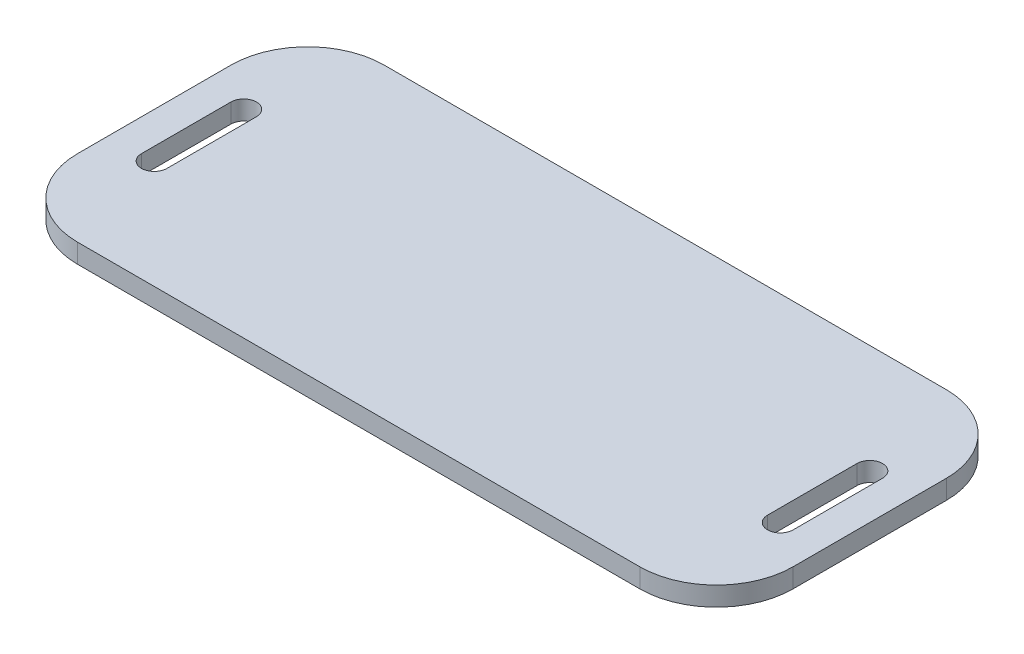
ISO-10303-21;
HEADER;
FILE_DESCRIPTION(('STEP AP214'),'2;1');
FILE_NAME('part.step','',(''),(''),'','','');
FILE_SCHEMA(('AUTOMOTIVE_DESIGN { 1 0 10303 214 1 1 1 1 }'));
ENDSEC;
DATA;
#1=APPLICATION_CONTEXT('core data for automotive mechanical design processes');
#2=APPLICATION_PROTOCOL_DEFINITION('international standard','automotive_design',2000,#1);
#3=PRODUCT_CONTEXT('',#1,'mechanical');
#4=PRODUCT('Part','Part','',(#3));
#5=PRODUCT_RELATED_PRODUCT_CATEGORY('part','',(#4));
#6=PRODUCT_DEFINITION_FORMATION('','',#4);
#7=PRODUCT_DEFINITION_CONTEXT('part definition',#1,'design');
#8=PRODUCT_DEFINITION('design','',#6,#7);
#9=PRODUCT_DEFINITION_SHAPE('','',#8);
#10=(LENGTH_UNIT() NAMED_UNIT(*) SI_UNIT(.MILLI.,.METRE.));
#11=(NAMED_UNIT(*) PLANE_ANGLE_UNIT() SI_UNIT($,.RADIAN.));
#12=(NAMED_UNIT(*) SI_UNIT($,.STERADIAN.) SOLID_ANGLE_UNIT());
#13=UNCERTAINTY_MEASURE_WITH_UNIT(LENGTH_MEASURE(1.E-05),#10,'distance_accuracy_value','');
#14=(GEOMETRIC_REPRESENTATION_CONTEXT(3) GLOBAL_UNCERTAINTY_ASSIGNED_CONTEXT((#13)) GLOBAL_UNIT_ASSIGNED_CONTEXT((#10,
#11,#12)) REPRESENTATION_CONTEXT('',''));
#15=CARTESIAN_POINT('',(0.,0.,0.));
#16=DIRECTION('',(0.,0.,1.));
#17=DIRECTION('',(1.,0.,0.));
#18=AXIS2_PLACEMENT_3D('',#15,#16,#17);
#19=CARTESIAN_POINT('',(-279.4,19.05,76.2));
#20=DIRECTION('',(0.,1.,0.));
#21=DIRECTION('',(0.,0.,1.));
#22=AXIS2_PLACEMENT_3D('',#19,#20,#21);
#23=PLANE('',#22);
#24=CARTESIAN_POINT('',(-279.4,19.05,76.2));
#25=DIRECTION('',(0.,1.,0.));
#26=DIRECTION('',(0.,0.,1.));
#27=AXIS2_PLACEMENT_3D('',#24,#25,#26);
#28=CIRCLE('',#27,76.2);
#29=CARTESIAN_POINT('',(-355.6,19.05,76.2));
#30=VERTEX_POINT('',#29);
#31=CARTESIAN_POINT('',(-279.4,19.05,152.4));
#32=VERTEX_POINT('',#31);
#33=EDGE_CURVE('E213',#30,#32,#28,.T.);
#34=ORIENTED_EDGE('',*,*,#33,.T.);
#35=DIRECTION('',(1.,0.,0.));
#36=VECTOR('',#35,1.);
#37=CARTESIAN_POINT('',(-279.4,19.05,152.4));
#38=LINE('',#37,#36);
#39=CARTESIAN_POINT('',(279.4,19.05,152.4));
#40=VERTEX_POINT('',#39);
#41=EDGE_CURVE('E216',#32,#40,#38,.T.);
#42=ORIENTED_EDGE('',*,*,#41,.T.);
#43=CARTESIAN_POINT('',(279.4,19.05,76.2));
#44=DIRECTION('',(0.,1.,0.));
#45=DIRECTION('',(0.,0.,1.));
#46=AXIS2_PLACEMENT_3D('',#43,#44,#45);
#47=CIRCLE('',#46,76.2);
#48=CARTESIAN_POINT('',(355.6,19.05,76.2));
#49=VERTEX_POINT('',#48);
#50=EDGE_CURVE('E219',#40,#49,#47,.T.);
#51=ORIENTED_EDGE('',*,*,#50,.T.);
#52=DIRECTION('',(0.,0.,-1.));
#53=VECTOR('',#52,1.);
#54=CARTESIAN_POINT('',(355.6,19.05,-76.2));
#55=LINE('',#54,#53);
#56=CARTESIAN_POINT('',(355.6,19.05,-76.2));
#57=VERTEX_POINT('',#56);
#58=EDGE_CURVE('E221',#49,#57,#55,.T.);
#59=ORIENTED_EDGE('',*,*,#58,.T.);
#60=CARTESIAN_POINT('',(279.4,19.05,-76.2));
#61=DIRECTION('',(0.,1.,0.));
#62=DIRECTION('',(0.,0.,-1.));
#63=AXIS2_PLACEMENT_3D('',#60,#61,#62);
#64=CIRCLE('',#63,76.2);
#65=CARTESIAN_POINT('',(279.4,19.05,-152.4));
#66=VERTEX_POINT('',#65);
#67=EDGE_CURVE('E223',#57,#66,#64,.T.);
#68=ORIENTED_EDGE('',*,*,#67,.T.);
#69=DIRECTION('',(-1.,0.,0.));
#70=VECTOR('',#69,1.);
#71=CARTESIAN_POINT('',(-279.4,19.05,-152.4));
#72=LINE('',#71,#70);
#73=CARTESIAN_POINT('',(-279.4,19.05,-152.4));
#74=VERTEX_POINT('',#73);
#75=EDGE_CURVE('E225',#66,#74,#72,.T.);
#76=ORIENTED_EDGE('',*,*,#75,.T.);
#77=CARTESIAN_POINT('',(-279.4,19.05,-76.2));
#78=DIRECTION('',(0.,1.,0.));
#79=DIRECTION('',(0.,0.,1.));
#80=AXIS2_PLACEMENT_3D('',#77,#78,#79);
#81=CIRCLE('',#80,76.2);
#82=CARTESIAN_POINT('',(-355.6,19.05,-76.2));
#83=VERTEX_POINT('',#82);
#84=EDGE_CURVE('E227',#74,#83,#81,.T.);
#85=ORIENTED_EDGE('',*,*,#84,.T.);
#86=DIRECTION('',(0.,0.,1.));
#87=VECTOR('',#86,1.);
#88=CARTESIAN_POINT('',(-355.6,19.05,-76.2));
#89=LINE('',#88,#87);
#90=EDGE_CURVE('E229',#83,#30,#89,.T.);
#91=ORIENTED_EDGE('',*,*,#90,.T.);
#92=EDGE_LOOP('',(#34,#42,#51,#59,#68,#76,#85,#91));
#93=FACE_BOUND('',#92,.T.);
#94=CARTESIAN_POINT('',(311.15,19.05,-44.45));
#95=DIRECTION('',(0.,1.,0.));
#96=DIRECTION('',(0.,0.,1.));
#97=AXIS2_PLACEMENT_3D('',#94,#95,#96);
#98=CIRCLE('',#97,12.7);
#99=CARTESIAN_POINT('',(323.85,19.05,-44.45));
#100=VERTEX_POINT('',#99);
#101=CARTESIAN_POINT('',(298.45,19.05,-44.45));
#102=VERTEX_POINT('',#101);
#103=EDGE_CURVE('E177',#100,#102,#98,.T.);
#104=ORIENTED_EDGE('',*,*,#103,.F.);
#105=DIRECTION('',(0.,0.,-1.));
#106=VECTOR('',#105,1.);
#107=CARTESIAN_POINT('',(323.85,19.05,-44.45));
#108=LINE('',#107,#106);
#109=CARTESIAN_POINT('',(323.85,19.05,44.45));
#110=VERTEX_POINT('',#109);
#111=EDGE_CURVE('E185',#110,#100,#108,.T.);
#112=ORIENTED_EDGE('',*,*,#111,.F.);
#113=CARTESIAN_POINT('',(311.15,19.05,44.45));
#114=DIRECTION('',(0.,1.,0.));
#115=DIRECTION('',(0.,0.,1.));
#116=AXIS2_PLACEMENT_3D('',#113,#114,#115);
#117=CIRCLE('',#116,12.7);
#118=CARTESIAN_POINT('',(298.45,19.05,44.45));
#119=VERTEX_POINT('',#118);
#120=EDGE_CURVE('E199',#119,#110,#117,.T.);
#121=ORIENTED_EDGE('',*,*,#120,.F.);
#122=DIRECTION('',(0.,0.,1.));
#123=VECTOR('',#122,1.);
#124=CARTESIAN_POINT('',(298.45,19.05,-44.45));
#125=LINE('',#124,#123);
#126=EDGE_CURVE('E196',#102,#119,#125,.T.);
#127=ORIENTED_EDGE('',*,*,#126,.F.);
#128=EDGE_LOOP('',(#104,#112,#121,#127));
#129=FACE_BOUND('',#128,.T.);
#130=DIRECTION('',(0.,0.,-1.));
#131=VECTOR('',#130,1.);
#132=CARTESIAN_POINT('',(-323.85,19.05,-44.45));
#133=LINE('',#132,#131);
#134=CARTESIAN_POINT('',(-323.85,19.05,44.45));
#135=VERTEX_POINT('',#134);
#136=CARTESIAN_POINT('',(-323.85,19.05,-44.45));
#137=VERTEX_POINT('',#136);
#138=EDGE_CURVE('E171',#135,#137,#133,.T.);
#139=ORIENTED_EDGE('',*,*,#138,.T.);
#140=CARTESIAN_POINT('',(-311.15,19.05,-44.45));
#141=DIRECTION('',(0.,-1.,0.));
#142=DIRECTION('',(0.,0.,1.));
#143=AXIS2_PLACEMENT_3D('',#140,#141,#142);
#144=CIRCLE('',#143,12.7);
#145=CARTESIAN_POINT('',(-298.45,19.05,-44.45));
#146=VERTEX_POINT('',#145);
#147=EDGE_CURVE('E48',#137,#146,#144,.T.);
#148=ORIENTED_EDGE('',*,*,#147,.T.);
#149=DIRECTION('',(0.,0.,1.));
#150=VECTOR('',#149,1.);
#151=CARTESIAN_POINT('',(-298.45,19.05,-44.45));
#152=LINE('',#151,#150);
#153=CARTESIAN_POINT('',(-298.45,19.05,44.45));
#154=VERTEX_POINT('',#153);
#155=EDGE_CURVE('E162',#146,#154,#152,.T.);
#156=ORIENTED_EDGE('',*,*,#155,.T.);
#157=CARTESIAN_POINT('',(-311.15,19.05,44.45));
#158=DIRECTION('',(0.,-1.,0.));
#159=DIRECTION('',(0.,0.,1.));
#160=AXIS2_PLACEMENT_3D('',#157,#158,#159);
#161=CIRCLE('',#160,12.7);
#162=EDGE_CURVE('E165',#154,#135,#161,.T.);
#163=ORIENTED_EDGE('',*,*,#162,.T.);
#164=EDGE_LOOP('',(#139,#148,#156,#163));
#165=FACE_BOUND('',#164,.T.);
#166=ADVANCED_FACE('F33',(#93,#129,#165),#23,.T.);
#167=CARTESIAN_POINT('',(-279.4,0.,76.2));
#168=DIRECTION('',(0.,1.,0.));
#169=DIRECTION('',(0.,0.,1.));
#170=AXIS2_PLACEMENT_3D('',#167,#168,#169);
#171=PLANE('',#170);
#172=CARTESIAN_POINT('',(-279.4,0.,76.2));
#173=DIRECTION('',(0.,1.,0.));
#174=DIRECTION('',(0.,0.,1.));
#175=AXIS2_PLACEMENT_3D('',#172,#173,#174);
#176=CIRCLE('',#175,76.2);
#177=CARTESIAN_POINT('',(-355.6,0.,76.2));
#178=VERTEX_POINT('',#177);
#179=CARTESIAN_POINT('',(-279.4,0.,152.4));
#180=VERTEX_POINT('',#179);
#181=EDGE_CURVE('E206',#178,#180,#176,.T.);
#182=ORIENTED_EDGE('',*,*,#181,.F.);
#183=DIRECTION('',(0.,0.,1.));
#184=VECTOR('',#183,1.);
#185=CARTESIAN_POINT('',(-355.6,0.,-76.2));
#186=LINE('',#185,#184);
#187=CARTESIAN_POINT('',(-355.6,0.,-76.2));
#188=VERTEX_POINT('',#187);
#189=EDGE_CURVE('E217',#188,#178,#186,.T.);
#190=ORIENTED_EDGE('',*,*,#189,.F.);
#191=CARTESIAN_POINT('',(-279.4,0.,-76.2));
#192=DIRECTION('',(0.,1.,0.));
#193=DIRECTION('',(0.,0.,1.));
#194=AXIS2_PLACEMENT_3D('',#191,#192,#193);
#195=CIRCLE('',#194,76.2);
#196=CARTESIAN_POINT('',(-279.4,0.,-152.4));
#197=VERTEX_POINT('',#196);
#198=EDGE_CURVE('E244',#197,#188,#195,.T.);
#199=ORIENTED_EDGE('',*,*,#198,.F.);
#200=DIRECTION('',(-1.,0.,0.));
#201=VECTOR('',#200,1.);
#202=CARTESIAN_POINT('',(-279.4,0.,-152.4));
#203=LINE('',#202,#201);
#204=CARTESIAN_POINT('',(279.4,0.,-152.4));
#205=VERTEX_POINT('',#204);
#206=EDGE_CURVE('E242',#205,#197,#203,.T.);
#207=ORIENTED_EDGE('',*,*,#206,.F.);
#208=CARTESIAN_POINT('',(279.4,0.,-76.2));
#209=DIRECTION('',(0.,1.,0.));
#210=DIRECTION('',(0.,0.,-1.));
#211=AXIS2_PLACEMENT_3D('',#208,#209,#210);
#212=CIRCLE('',#211,76.2);
#213=CARTESIAN_POINT('',(355.6,0.,-76.2));
#214=VERTEX_POINT('',#213);
#215=EDGE_CURVE('E240',#214,#205,#212,.T.);
#216=ORIENTED_EDGE('',*,*,#215,.F.);
#217=DIRECTION('',(0.,0.,-1.));
#218=VECTOR('',#217,1.);
#219=CARTESIAN_POINT('',(355.6,0.,-76.2));
#220=LINE('',#219,#218);
#221=CARTESIAN_POINT('',(355.6,0.,76.2));
#222=VERTEX_POINT('',#221);
#223=EDGE_CURVE('E238',#222,#214,#220,.T.);
#224=ORIENTED_EDGE('',*,*,#223,.F.);
#225=CARTESIAN_POINT('',(279.4,0.,76.2));
#226=DIRECTION('',(0.,1.,0.));
#227=DIRECTION('',(0.,0.,1.));
#228=AXIS2_PLACEMENT_3D('',#225,#226,#227);
#229=CIRCLE('',#228,76.2);
#230=CARTESIAN_POINT('',(279.4,0.,152.4));
#231=VERTEX_POINT('',#230);
#232=EDGE_CURVE('E236',#231,#222,#229,.T.);
#233=ORIENTED_EDGE('',*,*,#232,.F.);
#234=DIRECTION('',(1.,0.,0.));
#235=VECTOR('',#234,1.);
#236=CARTESIAN_POINT('',(-279.4,0.,152.4));
#237=LINE('',#236,#235);
#238=EDGE_CURVE('E234',#180,#231,#237,.T.);
#239=ORIENTED_EDGE('',*,*,#238,.F.);
#240=EDGE_LOOP('',(#182,#190,#199,#207,#216,#224,#233,#239));
#241=FACE_BOUND('',#240,.T.);
#242=DIRECTION('',(0.,0.,-1.));
#243=VECTOR('',#242,1.);
#244=CARTESIAN_POINT('',(323.85,0.,-44.45));
#245=LINE('',#244,#243);
#246=CARTESIAN_POINT('',(323.85,0.,44.45));
#247=VERTEX_POINT('',#246);
#248=CARTESIAN_POINT('',(323.85,0.,-44.45));
#249=VERTEX_POINT('',#248);
#250=EDGE_CURVE('E191',#247,#249,#245,.T.);
#251=ORIENTED_EDGE('',*,*,#250,.T.);
#252=CARTESIAN_POINT('',(311.15,0.,-44.45));
#253=DIRECTION('',(0.,1.,0.));
#254=DIRECTION('',(0.,0.,1.));
#255=AXIS2_PLACEMENT_3D('',#252,#253,#254);
#256=CIRCLE('',#255,12.7);
#257=CARTESIAN_POINT('',(298.45,0.,-44.45));
#258=VERTEX_POINT('',#257);
#259=EDGE_CURVE('E181',#249,#258,#256,.T.);
#260=ORIENTED_EDGE('',*,*,#259,.T.);
#261=DIRECTION('',(0.,0.,1.));
#262=VECTOR('',#261,1.);
#263=CARTESIAN_POINT('',(298.45,0.,-44.45));
#264=LINE('',#263,#262);
#265=CARTESIAN_POINT('',(298.45,0.,44.45));
#266=VERTEX_POINT('',#265);
#267=EDGE_CURVE('E184',#258,#266,#264,.T.);
#268=ORIENTED_EDGE('',*,*,#267,.T.);
#269=CARTESIAN_POINT('',(311.15,0.,44.45));
#270=DIRECTION('',(0.,1.,0.));
#271=DIRECTION('',(0.,0.,1.));
#272=AXIS2_PLACEMENT_3D('',#269,#270,#271);
#273=CIRCLE('',#272,12.7);
#274=EDGE_CURVE('E188',#266,#247,#273,.T.);
#275=ORIENTED_EDGE('',*,*,#274,.T.);
#276=EDGE_LOOP('',(#251,#260,#268,#275));
#277=FACE_BOUND('',#276,.T.);
#278=CARTESIAN_POINT('',(-311.15,0.,-44.45));
#279=DIRECTION('',(0.,-1.,0.));
#280=DIRECTION('',(0.,0.,1.));
#281=AXIS2_PLACEMENT_3D('',#278,#279,#280);
#282=CIRCLE('',#281,12.7);
#283=CARTESIAN_POINT('',(-323.85,0.,-44.45));
#284=VERTEX_POINT('',#283);
#285=CARTESIAN_POINT('',(-298.45,0.,-44.45));
#286=VERTEX_POINT('',#285);
#287=EDGE_CURVE('E154',#284,#286,#282,.T.);
#288=ORIENTED_EDGE('',*,*,#287,.F.);
#289=DIRECTION('',(0.,0.,-1.));
#290=VECTOR('',#289,1.);
#291=CARTESIAN_POINT('',(-323.85,0.,-44.45));
#292=LINE('',#291,#290);
#293=CARTESIAN_POINT('',(-323.85,0.,44.45));
#294=VERTEX_POINT('',#293);
#295=EDGE_CURVE('E146',#294,#284,#292,.T.);
#296=ORIENTED_EDGE('',*,*,#295,.F.);
#297=CARTESIAN_POINT('',(-311.15,0.,44.45));
#298=DIRECTION('',(0.,-1.,0.));
#299=DIRECTION('',(0.,0.,1.));
#300=AXIS2_PLACEMENT_3D('',#297,#298,#299);
#301=CIRCLE('',#300,12.7);
#302=CARTESIAN_POINT('',(-298.45,0.,44.45));
#303=VERTEX_POINT('',#302);
#304=EDGE_CURVE('E153',#303,#294,#301,.T.);
#305=ORIENTED_EDGE('',*,*,#304,.F.);
#306=DIRECTION('',(0.,0.,1.));
#307=VECTOR('',#306,1.);
#308=CARTESIAN_POINT('',(-298.45,0.,-44.45));
#309=LINE('',#308,#307);
#310=EDGE_CURVE('E158',#286,#303,#309,.T.);
#311=ORIENTED_EDGE('',*,*,#310,.F.);
#312=EDGE_LOOP('',(#288,#296,#305,#311));
#313=FACE_BOUND('',#312,.T.);
#314=ADVANCED_FACE('F161',(#241,#277,#313),#171,.F.);
#315=CARTESIAN_POINT('',(-279.4,19.05,76.2));
#316=DIRECTION('',(0.,-1.,0.));
#317=DIRECTION('',(0.,0.,-1.));
#318=AXIS2_PLACEMENT_3D('',#315,#316,#317);
#319=CYLINDRICAL_SURFACE('',#318,76.2);
#320=ORIENTED_EDGE('',*,*,#181,.T.);
#321=DIRECTION('',(0.,-1.,0.));
#322=VECTOR('',#321,1.);
#323=CARTESIAN_POINT('',(-279.4,19.05,152.4));
#324=LINE('',#323,#322);
#325=EDGE_CURVE('E11',#32,#180,#324,.T.);
#326=ORIENTED_EDGE('',*,*,#325,.F.);
#327=ORIENTED_EDGE('',*,*,#33,.F.);
#328=DIRECTION('',(0.,-1.,0.));
#329=VECTOR('',#328,1.);
#330=CARTESIAN_POINT('',(-355.6,19.05,76.2));
#331=LINE('',#330,#329);
#332=EDGE_CURVE('E231',#30,#178,#331,.T.);
#333=ORIENTED_EDGE('',*,*,#332,.T.);
#334=EDGE_LOOP('',(#320,#326,#327,#333));
#335=FACE_BOUND('',#334,.T.);
#336=ADVANCED_FACE('F35',(#335),#319,.T.);
#337=CARTESIAN_POINT('',(-279.4,19.05,152.4));
#338=DIRECTION('',(0.,0.,-1.));
#339=DIRECTION('',(-1.,0.,0.));
#340=AXIS2_PLACEMENT_3D('',#337,#338,#339);
#341=PLANE('',#340);
#342=ORIENTED_EDGE('',*,*,#238,.T.);
#343=DIRECTION('',(0.,-1.,0.));
#344=VECTOR('',#343,1.);
#345=CARTESIAN_POINT('',(279.4,19.05,152.4));
#346=LINE('',#345,#344);
#347=EDGE_CURVE('E41',#40,#231,#346,.T.);
#348=ORIENTED_EDGE('',*,*,#347,.F.);
#349=ORIENTED_EDGE('',*,*,#41,.F.);
#350=ORIENTED_EDGE('',*,*,#325,.T.);
#351=EDGE_LOOP('',(#342,#348,#349,#350));
#352=FACE_BOUND('',#351,.T.);
#353=ADVANCED_FACE('F291',(#352),#341,.F.);
#354=CARTESIAN_POINT('',(279.4,19.05,76.2));
#355=DIRECTION('',(0.,-1.,0.));
#356=DIRECTION('',(0.,0.,-1.));
#357=AXIS2_PLACEMENT_3D('',#354,#355,#356);
#358=CYLINDRICAL_SURFACE('',#357,76.2);
#359=ORIENTED_EDGE('',*,*,#232,.T.);
#360=DIRECTION('',(0.,-1.,0.));
#361=VECTOR('',#360,1.);
#362=CARTESIAN_POINT('',(355.6,19.05,76.2));
#363=LINE('',#362,#361);
#364=EDGE_CURVE('E261',#49,#222,#363,.T.);
#365=ORIENTED_EDGE('',*,*,#364,.F.);
#366=ORIENTED_EDGE('',*,*,#50,.F.);
#367=ORIENTED_EDGE('',*,*,#347,.T.);
#368=EDGE_LOOP('',(#359,#365,#366,#367));
#369=FACE_BOUND('',#368,.T.);
#370=ADVANCED_FACE('F268',(#369),#358,.T.);
#371=CARTESIAN_POINT('',(355.6,19.05,-76.2));
#372=DIRECTION('',(-1.,0.,0.));
#373=DIRECTION('',(0.,0.,1.));
#374=AXIS2_PLACEMENT_3D('',#371,#372,#373);
#375=PLANE('',#374);
#376=ORIENTED_EDGE('',*,*,#223,.T.);
#377=DIRECTION('',(0.,-1.,0.));
#378=VECTOR('',#377,1.);
#379=CARTESIAN_POINT('',(355.6,19.05,-76.2));
#380=LINE('',#379,#378);
#381=EDGE_CURVE('E258',#57,#214,#380,.T.);
#382=ORIENTED_EDGE('',*,*,#381,.F.);
#383=ORIENTED_EDGE('',*,*,#58,.F.);
#384=ORIENTED_EDGE('',*,*,#364,.T.);
#385=EDGE_LOOP('',(#376,#382,#383,#384));
#386=FACE_BOUND('',#385,.T.);
#387=ADVANCED_FACE('F279',(#386),#375,.F.);
#388=CARTESIAN_POINT('',(279.4,19.05,-76.2));
#389=DIRECTION('',(0.,-1.,0.));
#390=DIRECTION('',(0.,0.,-1.));
#391=AXIS2_PLACEMENT_3D('',#388,#389,#390);
#392=CYLINDRICAL_SURFACE('',#391,76.2);
#393=ORIENTED_EDGE('',*,*,#215,.T.);
#394=DIRECTION('',(0.,-1.,0.));
#395=VECTOR('',#394,1.);
#396=CARTESIAN_POINT('',(279.4,19.05,-152.4));
#397=LINE('',#396,#395);
#398=EDGE_CURVE('E255',#66,#205,#397,.T.);
#399=ORIENTED_EDGE('',*,*,#398,.F.);
#400=ORIENTED_EDGE('',*,*,#67,.F.);
#401=ORIENTED_EDGE('',*,*,#381,.T.);
#402=EDGE_LOOP('',(#393,#399,#400,#401));
#403=FACE_BOUND('',#402,.T.);
#404=ADVANCED_FACE('F283',(#403),#392,.T.);
#405=CARTESIAN_POINT('',(-279.4,19.05,-152.4));
#406=DIRECTION('',(0.,0.,1.));
#407=DIRECTION('',(1.,0.,0.));
#408=AXIS2_PLACEMENT_3D('',#405,#406,#407);
#409=PLANE('',#408);
#410=ORIENTED_EDGE('',*,*,#206,.T.);
#411=DIRECTION('',(0.,-1.,0.));
#412=VECTOR('',#411,1.);
#413=CARTESIAN_POINT('',(-279.4,19.05,-152.4));
#414=LINE('',#413,#412);
#415=EDGE_CURVE('E252',#74,#197,#414,.T.);
#416=ORIENTED_EDGE('',*,*,#415,.F.);
#417=ORIENTED_EDGE('',*,*,#75,.F.);
#418=ORIENTED_EDGE('',*,*,#398,.T.);
#419=EDGE_LOOP('',(#410,#416,#417,#418));
#420=FACE_BOUND('',#419,.T.);
#421=ADVANCED_FACE('F304',(#420),#409,.F.);
#422=CARTESIAN_POINT('',(-279.4,19.05,-76.2));
#423=DIRECTION('',(0.,-1.,0.));
#424=DIRECTION('',(0.,0.,-1.));
#425=AXIS2_PLACEMENT_3D('',#422,#423,#424);
#426=CYLINDRICAL_SURFACE('',#425,76.2);
#427=ORIENTED_EDGE('',*,*,#198,.T.);
#428=DIRECTION('',(0.,-1.,0.));
#429=VECTOR('',#428,1.);
#430=CARTESIAN_POINT('',(-355.6,19.05,-76.2));
#431=LINE('',#430,#429);
#432=EDGE_CURVE('E249',#83,#188,#431,.T.);
#433=ORIENTED_EDGE('',*,*,#432,.F.);
#434=ORIENTED_EDGE('',*,*,#84,.F.);
#435=ORIENTED_EDGE('',*,*,#415,.T.);
#436=EDGE_LOOP('',(#427,#433,#434,#435));
#437=FACE_BOUND('',#436,.T.);
#438=ADVANCED_FACE('F302',(#437),#426,.T.);
#439=CARTESIAN_POINT('',(-355.6,19.05,-76.2));
#440=DIRECTION('',(1.,0.,0.));
#441=DIRECTION('',(0.,0.,-1.));
#442=AXIS2_PLACEMENT_3D('',#439,#440,#441);
#443=PLANE('',#442);
#444=ORIENTED_EDGE('',*,*,#189,.T.);
#445=ORIENTED_EDGE('',*,*,#332,.F.);
#446=ORIENTED_EDGE('',*,*,#90,.F.);
#447=ORIENTED_EDGE('',*,*,#432,.T.);
#448=EDGE_LOOP('',(#444,#445,#446,#447));
#449=FACE_BOUND('',#448,.T.);
#450=ADVANCED_FACE('F297',(#449),#443,.F.);
#451=CARTESIAN_POINT('',(311.15,0.,-44.45));
#452=DIRECTION('',(0.,1.,0.));
#453=DIRECTION('',(0.,0.,1.));
#454=AXIS2_PLACEMENT_3D('',#451,#452,#453);
#455=CYLINDRICAL_SURFACE('',#454,12.7);
#456=ORIENTED_EDGE('',*,*,#103,.T.);
#457=DIRECTION('',(0.,1.,0.));
#458=VECTOR('',#457,1.);
#459=CARTESIAN_POINT('',(298.45,0.,-44.45));
#460=LINE('',#459,#458);
#461=EDGE_CURVE('E194',#258,#102,#460,.T.);
#462=ORIENTED_EDGE('',*,*,#461,.F.);
#463=ORIENTED_EDGE('',*,*,#259,.F.);
#464=DIRECTION('',(0.,1.,0.));
#465=VECTOR('',#464,1.);
#466=CARTESIAN_POINT('',(323.85,0.,-44.45));
#467=LINE('',#466,#465);
#468=EDGE_CURVE('E204',#249,#100,#467,.T.);
#469=ORIENTED_EDGE('',*,*,#468,.T.);
#470=EDGE_LOOP('',(#456,#462,#463,#469));
#471=FACE_BOUND('',#470,.T.);
#472=ADVANCED_FACE('F320',(#471),#455,.F.);
#473=CARTESIAN_POINT('',(323.85,0.,-44.45));
#474=DIRECTION('',(1.,0.,0.));
#475=DIRECTION('',(0.,0.,-1.));
#476=AXIS2_PLACEMENT_3D('',#473,#474,#475);
#477=PLANE('',#476);
#478=ORIENTED_EDGE('',*,*,#111,.T.);
#479=ORIENTED_EDGE('',*,*,#468,.F.);
#480=ORIENTED_EDGE('',*,*,#250,.F.);
#481=DIRECTION('',(0.,1.,0.));
#482=VECTOR('',#481,1.);
#483=CARTESIAN_POINT('',(323.85,0.,44.45));
#484=LINE('',#483,#482);
#485=EDGE_CURVE('E207',#247,#110,#484,.T.);
#486=ORIENTED_EDGE('',*,*,#485,.T.);
#487=EDGE_LOOP('',(#478,#479,#480,#486));
#488=FACE_BOUND('',#487,.T.);
#489=ADVANCED_FACE('F327',(#488),#477,.F.);
#490=CARTESIAN_POINT('',(311.15,0.,44.45));
#491=DIRECTION('',(0.,1.,0.));
#492=DIRECTION('',(0.,0.,1.));
#493=AXIS2_PLACEMENT_3D('',#490,#491,#492);
#494=CYLINDRICAL_SURFACE('',#493,12.7);
#495=ORIENTED_EDGE('',*,*,#120,.T.);
#496=ORIENTED_EDGE('',*,*,#485,.F.);
#497=ORIENTED_EDGE('',*,*,#274,.F.);
#498=DIRECTION('',(0.,1.,0.));
#499=VECTOR('',#498,1.);
#500=CARTESIAN_POINT('',(298.45,0.,44.45));
#501=LINE('',#500,#499);
#502=EDGE_CURVE('E209',#266,#119,#501,.T.);
#503=ORIENTED_EDGE('',*,*,#502,.T.);
#504=EDGE_LOOP('',(#495,#496,#497,#503));
#505=FACE_BOUND('',#504,.T.);
#506=ADVANCED_FACE('F332',(#505),#494,.F.);
#507=CARTESIAN_POINT('',(298.45,0.,-44.45));
#508=DIRECTION('',(-1.,0.,0.));
#509=DIRECTION('',(0.,0.,1.));
#510=AXIS2_PLACEMENT_3D('',#507,#508,#509);
#511=PLANE('',#510);
#512=ORIENTED_EDGE('',*,*,#126,.T.);
#513=ORIENTED_EDGE('',*,*,#502,.F.);
#514=ORIENTED_EDGE('',*,*,#267,.F.);
#515=ORIENTED_EDGE('',*,*,#461,.T.);
#516=EDGE_LOOP('',(#512,#513,#514,#515));
#517=FACE_BOUND('',#516,.T.);
#518=ADVANCED_FACE('F341',(#517),#511,.F.);
#519=CARTESIAN_POINT('',(-311.15,0.,-44.45));
#520=DIRECTION('',(0.,1.,0.));
#521=DIRECTION('',(0.,0.,1.));
#522=AXIS2_PLACEMENT_3D('',#519,#520,#521);
#523=CYLINDRICAL_SURFACE('',#522,12.7);
#524=ORIENTED_EDGE('',*,*,#147,.F.);
#525=DIRECTION('',(0.,1.,0.));
#526=VECTOR('',#525,1.);
#527=CARTESIAN_POINT('',(-323.85,0.,-44.45));
#528=LINE('',#527,#526);
#529=EDGE_CURVE('E148',#284,#137,#528,.T.);
#530=ORIENTED_EDGE('',*,*,#529,.F.);
#531=ORIENTED_EDGE('',*,*,#287,.T.);
#532=DIRECTION('',(0.,1.,0.));
#533=VECTOR('',#532,1.);
#534=CARTESIAN_POINT('',(-298.45,0.,-44.45));
#535=LINE('',#534,#533);
#536=EDGE_CURVE('E175',#286,#146,#535,.T.);
#537=ORIENTED_EDGE('',*,*,#536,.T.);
#538=EDGE_LOOP('',(#524,#530,#531,#537));
#539=FACE_BOUND('',#538,.T.);
#540=ADVANCED_FACE('F156',(#539),#523,.F.);
#541=CARTESIAN_POINT('',(-298.45,0.,-44.45));
#542=DIRECTION('',(-1.,0.,0.));
#543=DIRECTION('',(0.,0.,1.));
#544=AXIS2_PLACEMENT_3D('',#541,#542,#543);
#545=PLANE('',#544);
#546=ORIENTED_EDGE('',*,*,#155,.F.);
#547=ORIENTED_EDGE('',*,*,#536,.F.);
#548=ORIENTED_EDGE('',*,*,#310,.T.);
#549=DIRECTION('',(0.,1.,0.));
#550=VECTOR('',#549,1.);
#551=CARTESIAN_POINT('',(-298.45,0.,44.45));
#552=LINE('',#551,#550);
#553=EDGE_CURVE('E178',#303,#154,#552,.T.);
#554=ORIENTED_EDGE('',*,*,#553,.T.);
#555=EDGE_LOOP('',(#546,#547,#548,#554));
#556=FACE_BOUND('',#555,.T.);
#557=ADVANCED_FACE('F355',(#556),#545,.T.);
#558=CARTESIAN_POINT('',(-311.15,0.,44.45));
#559=DIRECTION('',(0.,1.,0.));
#560=DIRECTION('',(0.,0.,1.));
#561=AXIS2_PLACEMENT_3D('',#558,#559,#560);
#562=CYLINDRICAL_SURFACE('',#561,12.7);
#563=ORIENTED_EDGE('',*,*,#162,.F.);
#564=ORIENTED_EDGE('',*,*,#553,.F.);
#565=ORIENTED_EDGE('',*,*,#304,.T.);
#566=DIRECTION('',(0.,1.,0.));
#567=VECTOR('',#566,1.);
#568=CARTESIAN_POINT('',(-323.85,0.,44.45));
#569=LINE('',#568,#567);
#570=EDGE_CURVE('E56',#294,#135,#569,.T.);
#571=ORIENTED_EDGE('',*,*,#570,.T.);
#572=EDGE_LOOP('',(#563,#564,#565,#571));
#573=FACE_BOUND('',#572,.T.);
#574=ADVANCED_FACE('F358',(#573),#562,.F.);
#575=CARTESIAN_POINT('',(-323.85,0.,-44.45));
#576=DIRECTION('',(1.,0.,0.));
#577=DIRECTION('',(0.,0.,-1.));
#578=AXIS2_PLACEMENT_3D('',#575,#576,#577);
#579=PLANE('',#578);
#580=ORIENTED_EDGE('',*,*,#138,.F.);
#581=ORIENTED_EDGE('',*,*,#570,.F.);
#582=ORIENTED_EDGE('',*,*,#295,.T.);
#583=ORIENTED_EDGE('',*,*,#529,.T.);
#584=EDGE_LOOP('',(#580,#581,#582,#583));
#585=FACE_BOUND('',#584,.T.);
#586=ADVANCED_FACE('F147',(#585),#579,.T.);
#587=CLOSED_SHELL('',(#166,#314,#336,#353,#370,#387,#404,#421,#438,#450,#472,#489,#506,#518,
#540,#557,#574,#586));
#588=MANIFOLD_SOLID_BREP('B2',#587);
#589=ADVANCED_BREP_SHAPE_REPRESENTATION('',(#18,#588),#14);
#590=SHAPE_DEFINITION_REPRESENTATION(#9,#589);
ENDSEC;
END-ISO-10303-21;
